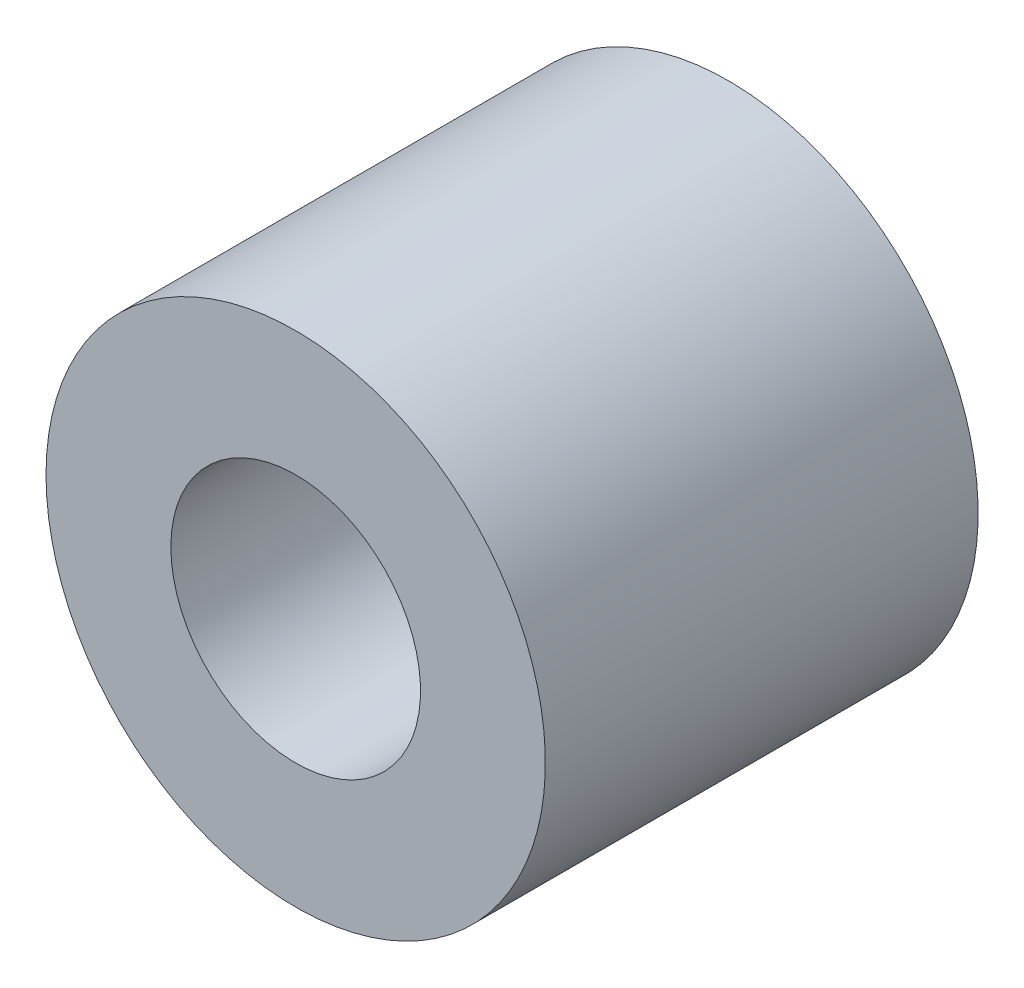
ISO-10303-21;
HEADER;
FILE_DESCRIPTION(('STEP AP214'),'2;1');
FILE_NAME('part.step','',(''),(''),'','','');
FILE_SCHEMA(('AUTOMOTIVE_DESIGN { 1 0 10303 214 1 1 1 1 }'));
ENDSEC;
DATA;
#1=APPLICATION_CONTEXT('core data for automotive mechanical design processes');
#2=APPLICATION_PROTOCOL_DEFINITION('international standard','automotive_design',2000,#1);
#3=PRODUCT_CONTEXT('',#1,'mechanical');
#4=PRODUCT('Part','Part','',(#3));
#5=PRODUCT_RELATED_PRODUCT_CATEGORY('part','',(#4));
#6=PRODUCT_DEFINITION_FORMATION('','',#4);
#7=PRODUCT_DEFINITION_CONTEXT('part definition',#1,'design');
#8=PRODUCT_DEFINITION('design','',#6,#7);
#9=PRODUCT_DEFINITION_SHAPE('','',#8);
#10=(LENGTH_UNIT() NAMED_UNIT(*) SI_UNIT(.MILLI.,.METRE.));
#11=(NAMED_UNIT(*) PLANE_ANGLE_UNIT() SI_UNIT($,.RADIAN.));
#12=(NAMED_UNIT(*) SI_UNIT($,.STERADIAN.) SOLID_ANGLE_UNIT());
#13=UNCERTAINTY_MEASURE_WITH_UNIT(LENGTH_MEASURE(1.E-05),#10,'distance_accuracy_value','');
#14=(GEOMETRIC_REPRESENTATION_CONTEXT(3) GLOBAL_UNCERTAINTY_ASSIGNED_CONTEXT((#13)) GLOBAL_UNIT_ASSIGNED_CONTEXT((#10,
#11,#12)) REPRESENTATION_CONTEXT('',''));
#15=CARTESIAN_POINT('',(0.,0.,0.));
#16=DIRECTION('',(0.,0.,1.));
#17=DIRECTION('',(1.,0.,0.));
#18=AXIS2_PLACEMENT_3D('',#15,#16,#17);
#19=CARTESIAN_POINT('',(11.44,1.27,-0.005));
#20=DIRECTION('',(0.,0.,-1.));
#21=DIRECTION('',(-1.,0.,0.));
#22=AXIS2_PLACEMENT_3D('',#19,#20,#21);
#23=CYLINDRICAL_SURFACE('',#22,0.45);
#24=CARTESIAN_POINT('',(11.44,1.27,1.555));
#25=DIRECTION('',(0.,0.,-1.));
#26=DIRECTION('',(-1.,0.,0.));
#27=AXIS2_PLACEMENT_3D('',#24,#25,#26);
#28=CIRCLE('',#27,0.45);
#29=CARTESIAN_POINT('',(10.99,1.27,1.555));
#30=VERTEX_POINT('',#29);
#31=EDGE_CURVE('E18',#30,#30,#28,.T.);
#32=ORIENTED_EDGE('',*,*,#31,.F.);
#33=EDGE_LOOP('',(#32));
#34=FACE_BOUND('',#33,.T.);
#35=CARTESIAN_POINT('',(11.44,1.27,-0.005));
#36=DIRECTION('',(0.,0.,-1.));
#37=DIRECTION('',(-1.,0.,0.));
#38=AXIS2_PLACEMENT_3D('',#35,#36,#37);
#39=CIRCLE('',#38,0.45);
#40=CARTESIAN_POINT('',(10.99,1.27,-0.005));
#41=VERTEX_POINT('',#40);
#42=EDGE_CURVE('E27',#41,#41,#39,.T.);
#43=ORIENTED_EDGE('',*,*,#42,.T.);
#44=EDGE_LOOP('',(#43));
#45=FACE_BOUND('',#44,.T.);
#46=ADVANCED_FACE('F15',(#34,#45),#23,.F.);
#47=CARTESIAN_POINT('',(11.44,1.27,1.555));
#48=DIRECTION('',(0.,0.,1.));
#49=DIRECTION('',(1.,0.,0.));
#50=AXIS2_PLACEMENT_3D('',#47,#48,#49);
#51=PLANE('',#50);
#52=ORIENTED_EDGE('',*,*,#31,.T.);
#53=EDGE_LOOP('',(#52));
#54=FACE_BOUND('',#53,.T.);
#55=CARTESIAN_POINT('',(11.44,1.27,1.555));
#56=DIRECTION('',(0.,0.,-1.));
#57=DIRECTION('',(-1.,0.,0.));
#58=AXIS2_PLACEMENT_3D('',#55,#56,#57);
#59=CIRCLE('',#58,0.9);
#60=CARTESIAN_POINT('',(10.54,1.27,1.555));
#61=VERTEX_POINT('',#60);
#62=EDGE_CURVE('E22',#61,#61,#59,.T.);
#63=ORIENTED_EDGE('',*,*,#62,.F.);
#64=EDGE_LOOP('',(#63));
#65=FACE_BOUND('',#64,.T.);
#66=ADVANCED_FACE('F35',(#54,#65),#51,.T.);
#67=CARTESIAN_POINT('',(11.44,1.27,-0.005));
#68=DIRECTION('',(0.,0.,1.));
#69=DIRECTION('',(1.,0.,0.));
#70=AXIS2_PLACEMENT_3D('',#67,#68,#69);
#71=PLANE('',#70);
#72=ORIENTED_EDGE('',*,*,#42,.F.);
#73=EDGE_LOOP('',(#72));
#74=FACE_BOUND('',#73,.T.);
#75=CARTESIAN_POINT('',(11.44,1.27,-0.005));
#76=DIRECTION('',(0.,0.,-1.));
#77=DIRECTION('',(-1.,0.,0.));
#78=AXIS2_PLACEMENT_3D('',#75,#76,#77);
#79=CIRCLE('',#78,0.9);
#80=CARTESIAN_POINT('',(10.54,1.27,-0.005));
#81=VERTEX_POINT('',#80);
#82=EDGE_CURVE('E10',#81,#81,#79,.F.);
#83=ORIENTED_EDGE('',*,*,#82,.F.);
#84=EDGE_LOOP('',(#83));
#85=FACE_BOUND('',#84,.T.);
#86=ADVANCED_FACE('F43',(#74,#85),#71,.F.);
#87=CARTESIAN_POINT('',(11.44,1.27,-0.005));
#88=DIRECTION('',(0.,0.,-1.));
#89=DIRECTION('',(-1.,0.,0.));
#90=AXIS2_PLACEMENT_3D('',#87,#88,#89);
#91=CYLINDRICAL_SURFACE('',#90,0.9);
#92=ORIENTED_EDGE('',*,*,#62,.T.);
#93=EDGE_LOOP('',(#92));
#94=FACE_BOUND('',#93,.T.);
#95=ORIENTED_EDGE('',*,*,#82,.T.);
#96=EDGE_LOOP('',(#95));
#97=FACE_BOUND('',#96,.T.);
#98=ADVANCED_FACE('F44',(#94,#97),#91,.T.);
#99=CLOSED_SHELL('',(#46,#66,#86,#98));
#100=MANIFOLD_SOLID_BREP('B1',#99);
#101=ADVANCED_BREP_SHAPE_REPRESENTATION('',(#18,#100),#14);
#102=SHAPE_DEFINITION_REPRESENTATION(#9,#101);
ENDSEC;
END-ISO-10303-21;
